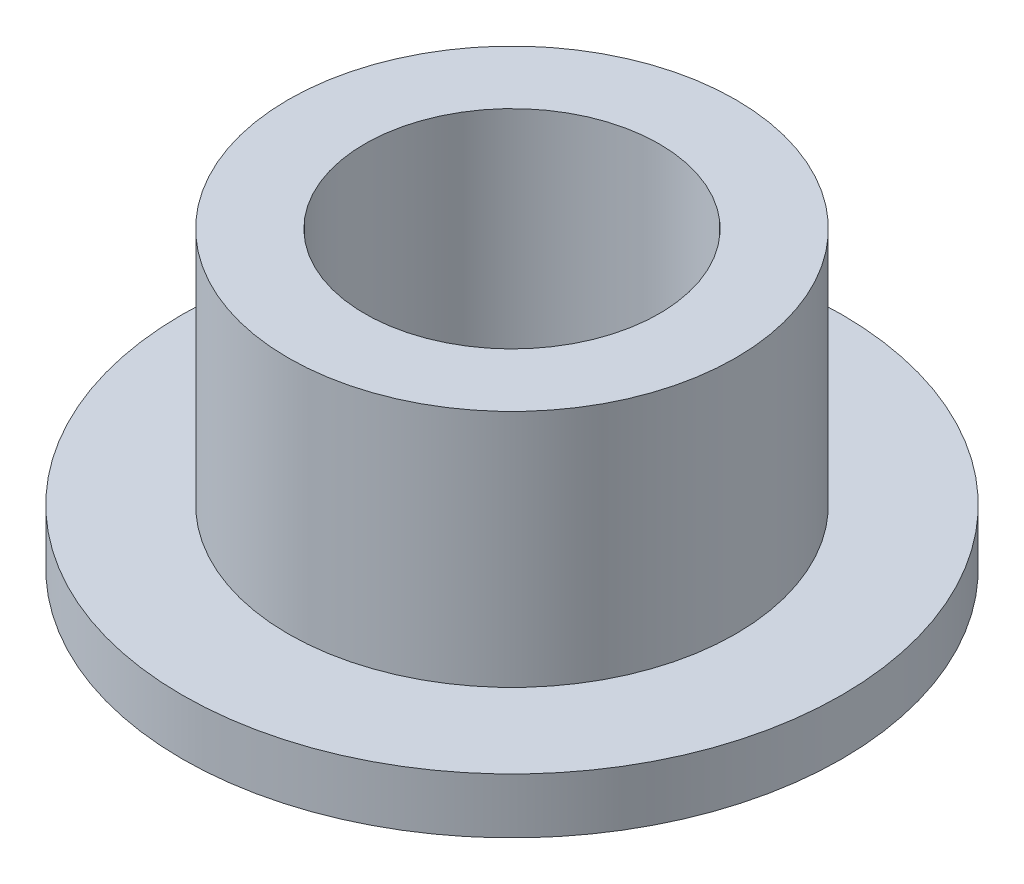
ISO-10303-21;
HEADER;
FILE_DESCRIPTION(('STEP AP214'),'2;1');
FILE_NAME('part.step','',(''),(''),'','','');
FILE_SCHEMA(('AUTOMOTIVE_DESIGN { 1 0 10303 214 1 1 1 1 }'));
ENDSEC;
DATA;
#1=APPLICATION_CONTEXT('core data for automotive mechanical design processes');
#2=APPLICATION_PROTOCOL_DEFINITION('international standard','automotive_design',2000,#1);
#3=PRODUCT_CONTEXT('',#1,'mechanical');
#4=PRODUCT('Part','Part','',(#3));
#5=PRODUCT_RELATED_PRODUCT_CATEGORY('part','',(#4));
#6=PRODUCT_DEFINITION_FORMATION('','',#4);
#7=PRODUCT_DEFINITION_CONTEXT('part definition',#1,'design');
#8=PRODUCT_DEFINITION('design','',#6,#7);
#9=PRODUCT_DEFINITION_SHAPE('','',#8);
#10=(LENGTH_UNIT() NAMED_UNIT(*) SI_UNIT(.MILLI.,.METRE.));
#11=(NAMED_UNIT(*) PLANE_ANGLE_UNIT() SI_UNIT($,.RADIAN.));
#12=(NAMED_UNIT(*) SI_UNIT($,.STERADIAN.) SOLID_ANGLE_UNIT());
#13=UNCERTAINTY_MEASURE_WITH_UNIT(LENGTH_MEASURE(1.E-05),#10,'distance_accuracy_value','');
#14=(GEOMETRIC_REPRESENTATION_CONTEXT(3) GLOBAL_UNCERTAINTY_ASSIGNED_CONTEXT((#13)) GLOBAL_UNIT_ASSIGNED_CONTEXT((#10,
#11,#12)) REPRESENTATION_CONTEXT('',''));
#15=CARTESIAN_POINT('',(0.,0.,0.));
#16=DIRECTION('',(0.,0.,1.));
#17=DIRECTION('',(1.,0.,0.));
#18=AXIS2_PLACEMENT_3D('',#15,#16,#17);
#19=CARTESIAN_POINT('',(0.,1.1938,0.));
#20=DIRECTION('',(0.,-1.,0.));
#21=DIRECTION('',(0.,0.,-1.));
#22=AXIS2_PLACEMENT_3D('',#19,#20,#21);
#23=CYLINDRICAL_SURFACE('',#22,7.112);
#24=CARTESIAN_POINT('',(0.,1.1938,0.));
#25=DIRECTION('',(0.,1.,0.));
#26=DIRECTION('',(0.,0.,1.));
#27=AXIS2_PLACEMENT_3D('',#24,#25,#26);
#28=CIRCLE('',#27,7.112);
#29=CARTESIAN_POINT('',(0.,1.1938,7.112));
#30=VERTEX_POINT('',#29);
#31=EDGE_CURVE('E10',#30,#30,#28,.T.);
#32=ORIENTED_EDGE('',*,*,#31,.F.);
#33=EDGE_LOOP('',(#32));
#34=FACE_BOUND('',#33,.T.);
#35=CARTESIAN_POINT('',(0.,0.,0.));
#36=DIRECTION('',(0.,1.,0.));
#37=DIRECTION('',(0.,0.,1.));
#38=AXIS2_PLACEMENT_3D('',#35,#36,#37);
#39=CIRCLE('',#38,7.112);
#40=CARTESIAN_POINT('',(0.,0.,7.112));
#41=VERTEX_POINT('',#40);
#42=EDGE_CURVE('E37',#41,#41,#39,.T.);
#43=ORIENTED_EDGE('',*,*,#42,.T.);
#44=EDGE_LOOP('',(#43));
#45=FACE_BOUND('',#44,.T.);
#46=ADVANCED_FACE('F34',(#34,#45),#23,.T.);
#47=CARTESIAN_POINT('',(0.,1.1938,0.));
#48=DIRECTION('',(0.,1.,0.));
#49=DIRECTION('',(0.,0.,1.));
#50=AXIS2_PLACEMENT_3D('',#47,#48,#49);
#51=PLANE('',#50);
#52=CARTESIAN_POINT('',(0.,1.1938,0.));
#53=DIRECTION('',(0.,1.,0.));
#54=DIRECTION('',(0.,0.,1.));
#55=AXIS2_PLACEMENT_3D('',#52,#53,#54);
#56=CIRCLE('',#55,4.826);
#57=CARTESIAN_POINT('',(0.,1.1938,4.826));
#58=VERTEX_POINT('',#57);
#59=EDGE_CURVE('E44',#58,#58,#56,.F.);
#60=ORIENTED_EDGE('',*,*,#59,.T.);
#61=EDGE_LOOP('',(#60));
#62=FACE_BOUND('',#61,.T.);
#63=ORIENTED_EDGE('',*,*,#31,.T.);
#64=EDGE_LOOP('',(#63));
#65=FACE_BOUND('',#64,.T.);
#66=ADVANCED_FACE('F71',(#62,#65),#51,.T.);
#67=CARTESIAN_POINT('',(0.,0.,0.));
#68=DIRECTION('',(0.,1.,0.));
#69=DIRECTION('',(0.,0.,1.));
#70=AXIS2_PLACEMENT_3D('',#67,#68,#69);
#71=PLANE('',#70);
#72=CARTESIAN_POINT('',(0.,0.,0.));
#73=DIRECTION('',(0.,-1.,0.));
#74=DIRECTION('',(0.,0.,-1.));
#75=AXIS2_PLACEMENT_3D('',#72,#73,#74);
#76=CIRCLE('',#75,3.175);
#77=CARTESIAN_POINT('',(0.,0.,-3.175));
#78=VERTEX_POINT('',#77);
#79=EDGE_CURVE('E52',#78,#78,#76,.T.);
#80=ORIENTED_EDGE('',*,*,#79,.F.);
#81=EDGE_LOOP('',(#80));
#82=FACE_BOUND('',#81,.T.);
#83=ORIENTED_EDGE('',*,*,#42,.F.);
#84=EDGE_LOOP('',(#83));
#85=FACE_BOUND('',#84,.T.);
#86=ADVANCED_FACE('F67',(#82,#85),#71,.F.);
#87=CARTESIAN_POINT('',(0.,6.35,0.));
#88=DIRECTION('',(0.,-1.,0.));
#89=DIRECTION('',(0.,0.,-1.));
#90=AXIS2_PLACEMENT_3D('',#87,#88,#89);
#91=CYLINDRICAL_SURFACE('',#90,4.826);
#92=ORIENTED_EDGE('',*,*,#59,.F.);
#93=EDGE_LOOP('',(#92));
#94=FACE_BOUND('',#93,.T.);
#95=CARTESIAN_POINT('',(0.,6.35,0.));
#96=DIRECTION('',(0.,1.,0.));
#97=DIRECTION('',(0.,0.,1.));
#98=AXIS2_PLACEMENT_3D('',#95,#96,#97);
#99=CIRCLE('',#98,4.826);
#100=CARTESIAN_POINT('',(0.,6.35,4.826));
#101=VERTEX_POINT('',#100);
#102=EDGE_CURVE('E48',#101,#101,#99,.T.);
#103=ORIENTED_EDGE('',*,*,#102,.F.);
#104=EDGE_LOOP('',(#103));
#105=FACE_BOUND('',#104,.T.);
#106=ADVANCED_FACE('F70',(#94,#105),#91,.T.);
#107=CARTESIAN_POINT('',(0.,6.35,0.));
#108=DIRECTION('',(0.,1.,0.));
#109=DIRECTION('',(0.,0.,1.));
#110=AXIS2_PLACEMENT_3D('',#107,#108,#109);
#111=PLANE('',#110);
#112=CARTESIAN_POINT('',(0.,6.35,0.));
#113=DIRECTION('',(0.,-1.,0.));
#114=DIRECTION('',(0.,0.,-1.));
#115=AXIS2_PLACEMENT_3D('',#112,#113,#114);
#116=CIRCLE('',#115,3.175);
#117=CARTESIAN_POINT('',(0.,6.35,-3.175));
#118=VERTEX_POINT('',#117);
#119=EDGE_CURVE('E51',#118,#118,#116,.T.);
#120=ORIENTED_EDGE('',*,*,#119,.T.);
#121=EDGE_LOOP('',(#120));
#122=FACE_BOUND('',#121,.T.);
#123=ORIENTED_EDGE('',*,*,#102,.T.);
#124=EDGE_LOOP('',(#123));
#125=FACE_BOUND('',#124,.T.);
#126=ADVANCED_FACE('F58',(#122,#125),#111,.T.);
#127=CARTESIAN_POINT('',(0.,6.35,0.));
#128=DIRECTION('',(0.,-1.,0.));
#129=DIRECTION('',(0.,0.,-1.));
#130=AXIS2_PLACEMENT_3D('',#127,#128,#129);
#131=CYLINDRICAL_SURFACE('',#130,3.175);
#132=ORIENTED_EDGE('',*,*,#119,.F.);
#133=EDGE_LOOP('',(#132));
#134=FACE_BOUND('',#133,.T.);
#135=ORIENTED_EDGE('',*,*,#79,.T.);
#136=EDGE_LOOP('',(#135));
#137=FACE_BOUND('',#136,.T.);
#138=ADVANCED_FACE('F61',(#134,#137),#131,.F.);
#139=CLOSED_SHELL('',(#46,#66,#86,#106,#126,#138));
#140=MANIFOLD_SOLID_BREP('B2',#139);
#141=ADVANCED_BREP_SHAPE_REPRESENTATION('',(#18,#140),#14);
#142=SHAPE_DEFINITION_REPRESENTATION(#9,#141);
ENDSEC;
END-ISO-10303-21;
